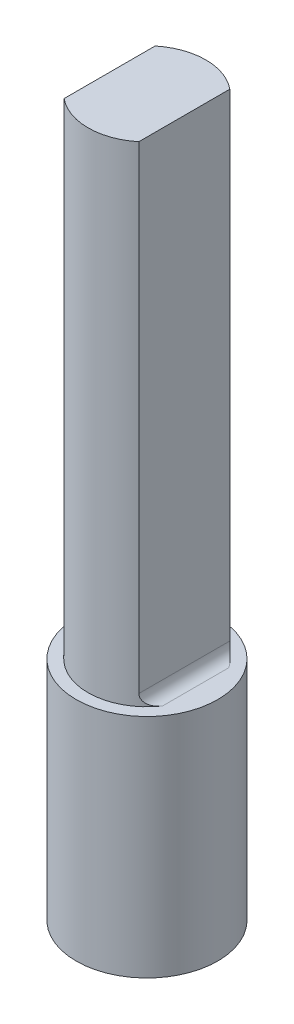
ISO-10303-21;
HEADER;
FILE_DESCRIPTION(('STEP AP214'),'2;1');
FILE_NAME('part.step','',(''),(''),'','','');
FILE_SCHEMA(('AUTOMOTIVE_DESIGN { 1 0 10303 214 1 1 1 1 }'));
ENDSEC;
DATA;
#1=APPLICATION_CONTEXT('core data for automotive mechanical design processes');
#2=APPLICATION_PROTOCOL_DEFINITION('international standard','automotive_design',2000,#1);
#3=PRODUCT_CONTEXT('',#1,'mechanical');
#4=PRODUCT('Part','Part','',(#3));
#5=PRODUCT_RELATED_PRODUCT_CATEGORY('part','',(#4));
#6=PRODUCT_DEFINITION_FORMATION('','',#4);
#7=PRODUCT_DEFINITION_CONTEXT('part definition',#1,'design');
#8=PRODUCT_DEFINITION('design','',#6,#7);
#9=PRODUCT_DEFINITION_SHAPE('','',#8);
#10=(LENGTH_UNIT() NAMED_UNIT(*) SI_UNIT(.MILLI.,.METRE.));
#11=(NAMED_UNIT(*) PLANE_ANGLE_UNIT() SI_UNIT($,.RADIAN.));
#12=(NAMED_UNIT(*) SI_UNIT($,.STERADIAN.) SOLID_ANGLE_UNIT());
#13=UNCERTAINTY_MEASURE_WITH_UNIT(LENGTH_MEASURE(1.E-05),#10,'distance_accuracy_value','');
#14=(GEOMETRIC_REPRESENTATION_CONTEXT(3) GLOBAL_UNCERTAINTY_ASSIGNED_CONTEXT((#13)) GLOBAL_UNIT_ASSIGNED_CONTEXT((#10,
#11,#12)) REPRESENTATION_CONTEXT('',''));
#15=CARTESIAN_POINT('',(0.,0.,0.));
#16=DIRECTION('',(0.,0.,1.));
#17=DIRECTION('',(1.,0.,0.));
#18=AXIS2_PLACEMENT_3D('',#15,#16,#17);
#19=CARTESIAN_POINT('',(0.,5.,0.));
#20=DIRECTION('',(0.,-1.,0.));
#21=DIRECTION('',(0.,0.,-1.));
#22=AXIS2_PLACEMENT_3D('',#19,#20,#21);
#23=CYLINDRICAL_SURFACE('',#22,3.125);
#24=CARTESIAN_POINT('',(0.,5.,0.));
#25=DIRECTION('',(0.,1.,0.));
#26=DIRECTION('',(0.,0.,1.));
#27=AXIS2_PLACEMENT_3D('',#24,#25,#26);
#28=CIRCLE('',#27,3.125);
#29=CARTESIAN_POINT('',(0.,5.,3.125));
#30=VERTEX_POINT('',#29);
#31=EDGE_CURVE('E133',#30,#30,#28,.T.);
#32=ORIENTED_EDGE('',*,*,#31,.F.);
#33=EDGE_LOOP('',(#32));
#34=FACE_BOUND('',#33,.T.);
#35=CARTESIAN_POINT('',(0.,-5.,0.));
#36=DIRECTION('',(0.,1.,0.));
#37=DIRECTION('',(0.,0.,1.));
#38=AXIS2_PLACEMENT_3D('',#35,#36,#37);
#39=CIRCLE('',#38,3.125);
#40=CARTESIAN_POINT('',(0.,-5.,3.125));
#41=VERTEX_POINT('',#40);
#42=EDGE_CURVE('E128',#41,#41,#39,.T.);
#43=ORIENTED_EDGE('',*,*,#42,.T.);
#44=EDGE_LOOP('',(#43));
#45=FACE_BOUND('',#44,.T.);
#46=ADVANCED_FACE('F39',(#34,#45),#23,.T.);
#47=CARTESIAN_POINT('',(0.,5.,0.));
#48=DIRECTION('',(0.,1.,0.));
#49=DIRECTION('',(0.,0.,1.));
#50=AXIS2_PLACEMENT_3D('',#47,#48,#49);
#51=PLANE('',#50);
#52=CARTESIAN_POINT('',(0.,5.,0.));
#53=DIRECTION('',(0.,1.,0.));
#54=DIRECTION('',(0.,0.,1.));
#55=AXIS2_PLACEMENT_3D('',#52,#53,#54);
#56=CIRCLE('',#55,2.6);
#57=CARTESIAN_POINT('',(2.15,5.,-1.46201915172134));
#58=VERTEX_POINT('',#57);
#59=CARTESIAN_POINT('',(-2.15,5.,-1.46201915172134));
#60=VERTEX_POINT('',#59);
#61=EDGE_CURVE('E122',#58,#60,#56,.T.);
#62=ORIENTED_EDGE('',*,*,#61,.F.);
#63=DIRECTION('',(0.,0.,-1.));
#64=VECTOR('',#63,1.);
#65=CARTESIAN_POINT('',(2.15,5.,0.));
#66=LINE('',#65,#64);
#67=CARTESIAN_POINT('',(2.15,5.,1.46201915172134));
#68=VERTEX_POINT('',#67);
#69=EDGE_CURVE('E149',#58,#68,#66,.F.);
#70=ORIENTED_EDGE('',*,*,#69,.T.);
#71=CARTESIAN_POINT('',(0.,5.,0.));
#72=DIRECTION('',(0.,1.,0.));
#73=DIRECTION('',(0.,0.,1.));
#74=AXIS2_PLACEMENT_3D('',#71,#72,#73);
#75=CIRCLE('',#74,2.6);
#76=CARTESIAN_POINT('',(-2.15,5.,1.46201915172134));
#77=VERTEX_POINT('',#76);
#78=EDGE_CURVE('E198',#77,#68,#75,.T.);
#79=ORIENTED_EDGE('',*,*,#78,.F.);
#80=DIRECTION('',(0.,0.,1.));
#81=VECTOR('',#80,1.);
#82=CARTESIAN_POINT('',(-2.15,5.,0.));
#83=LINE('',#82,#81);
#84=EDGE_CURVE('E145',#77,#60,#83,.F.);
#85=ORIENTED_EDGE('',*,*,#84,.T.);
#86=EDGE_LOOP('',(#62,#70,#79,#85));
#87=FACE_BOUND('',#86,.T.);
#88=ORIENTED_EDGE('',*,*,#31,.T.);
#89=EDGE_LOOP('',(#88));
#90=FACE_BOUND('',#89,.T.);
#91=ADVANCED_FACE('F181',(#87,#90),#51,.T.);
#92=CARTESIAN_POINT('',(0.,-5.,0.));
#93=DIRECTION('',(0.,1.,0.));
#94=DIRECTION('',(0.,0.,1.));
#95=AXIS2_PLACEMENT_3D('',#92,#93,#94);
#96=PLANE('',#95);
#97=ORIENTED_EDGE('',*,*,#42,.F.);
#98=EDGE_LOOP('',(#97));
#99=FACE_BOUND('',#98,.T.);
#100=ADVANCED_FACE('F183',(#99),#96,.F.);
#101=CARTESIAN_POINT('',(0.,26.6,0.));
#102=DIRECTION('',(0.,-1.,0.));
#103=DIRECTION('',(0.,0.,-1.));
#104=AXIS2_PLACEMENT_3D('',#101,#102,#103);
#105=CYLINDRICAL_SURFACE('',#104,2.6);
#106=ORIENTED_EDGE('',*,*,#78,.T.);
#107=CARTESIAN_POINT('',(2.15,5.,1.46201915172134));
#108=CARTESIAN_POINT('',(2.13214893926979,5.00000870419004,1.48828019076594));
#109=CARTESIAN_POINT('',(2.11379233462878,5.00095772820948,1.51423071888645));
#110=CARTESIAN_POINT('',(2.07615080757069,5.00511696251503,1.56544076001844));
#111=CARTESIAN_POINT('',(2.05686203017962,5.00833747457193,1.59069657807328));
#112=CARTESIAN_POINT('',(2.01731775489546,5.01749349777636,1.6405662280391));
#113=CARTESIAN_POINT('',(1.9970522414764,5.02346804601395,1.6651652588742));
#114=CARTESIAN_POINT('',(1.95617554190187,5.03858257771035,1.71299845862608));
#115=CARTESIAN_POINT('',(1.93556517218849,5.04771587882874,1.73623538866303));
#116=CARTESIAN_POINT('',(1.89400814855078,5.06984491198724,1.78148667531625));
#117=CARTESIAN_POINT('',(1.87306306365448,5.08291459991408,1.80346706348541));
#118=CARTESIAN_POINT('',(1.8320739485162,5.11325827221602,1.84508878206223));
#119=CARTESIAN_POINT('',(1.81202630739307,5.13051319214058,1.86474013387851));
#120=CARTESIAN_POINT('',(1.77671780038985,5.16654103670392,1.89836118260812));
#121=CARTESIAN_POINT('',(1.76119516866958,5.18467122856801,1.91273981687796));
#122=CARTESIAN_POINT('',(1.73224540378138,5.22417575325125,1.93899654069926));
#123=CARTESIAN_POINT('',(1.71881776056849,5.24554929393869,1.95087523913044));
#124=CARTESIAN_POINT('',(1.69679483755491,5.28768023203842,1.97004251878954));
#125=CARTESIAN_POINT('',(1.68777322159316,5.30802035739621,1.97775707271938));
#126=CARTESIAN_POINT('',(1.67237835886704,5.35038785051409,1.9907919512184));
#127=CARTESIAN_POINT('',(1.66600122472005,5.37241268489551,1.99611579109406));
#128=CARTESIAN_POINT('',(1.65748788633574,5.41204514924782,2.00318687499706));
#129=CARTESIAN_POINT('',(1.65469602119519,5.42941624755442,2.00549031907575));
#130=CARTESIAN_POINT('',(1.65094466146425,5.4645198100488,2.00857740091236));
#131=CARTESIAN_POINT('',(1.64998857491628,5.48225288469731,2.00935821201079));
#132=CARTESIAN_POINT('',(1.65,5.5,2.00935312974101));
#133=B_SPLINE_CURVE_WITH_KNOTS('',3,(#107,#108,#109,#110,#111,#112,#113,#114,#115,#116,#117,
#118,#119,#120,#121,#122,#123,#124,#125,#126,#127,#128,#129,#130,#131,#132),.UNSPECIFIED.,.F.,
.F.,(4,2,2,2,2,2,2,2,2,2,2,2,4),(0.,0.0952835776654719,0.191002092392971,0.288121186733857,
0.385036069844265,0.483899246283,0.58232027321788,0.665588173496877,0.74883576966989,
0.819190036406663,0.889440512736171,0.942515985758388,0.995689896160678),.UNSPECIFIED.);
#134=CARTESIAN_POINT('',(1.65,5.50000000000001,2.00935312974101));
#135=VERTEX_POINT('',#134);
#136=EDGE_CURVE('E126',#68,#135,#133,.T.);
#137=ORIENTED_EDGE('',*,*,#136,.T.);
#138=DIRECTION('',(0.,-1.,0.));
#139=VECTOR('',#138,1.);
#140=CARTESIAN_POINT('',(1.65,26.6,2.00935312974101));
#141=LINE('',#140,#139);
#142=CARTESIAN_POINT('',(1.65,26.6,2.00935312974101));
#143=VERTEX_POINT('',#142);
#144=EDGE_CURVE('E104',#143,#135,#141,.T.);
#145=ORIENTED_EDGE('',*,*,#144,.F.);
#146=CARTESIAN_POINT('',(0.,26.6,0.));
#147=DIRECTION('',(0.,1.,0.));
#148=DIRECTION('',(0.,0.,1.));
#149=AXIS2_PLACEMENT_3D('',#146,#147,#148);
#150=CIRCLE('',#149,2.6);
#151=CARTESIAN_POINT('',(-1.65,26.6,2.00935312974101));
#152=VERTEX_POINT('',#151);
#153=EDGE_CURVE('E112',#152,#143,#150,.T.);
#154=ORIENTED_EDGE('',*,*,#153,.F.);
#155=DIRECTION('',(0.,-1.,0.));
#156=VECTOR('',#155,1.);
#157=CARTESIAN_POINT('',(-1.65,26.6,2.00935312974101));
#158=LINE('',#157,#156);
#159=CARTESIAN_POINT('',(-1.65,5.50000000000001,2.00935312974101));
#160=VERTEX_POINT('',#159);
#161=EDGE_CURVE('E199',#152,#160,#158,.T.);
#162=ORIENTED_EDGE('',*,*,#161,.T.);
#163=CARTESIAN_POINT('',(-1.65,5.5,2.00935312974101));
#164=CARTESIAN_POINT('',(-1.64996359471725,5.47681076749336,2.00937109235813));
#165=CARTESIAN_POINT('',(-1.65161080389504,5.45365308239492,2.00803048983314));
#166=CARTESIAN_POINT('',(-1.6579790276271,5.40818822793188,2.00278177353478));
#167=CARTESIAN_POINT('',(-1.66268321653932,5.3858771063642,1.99888771295884));
#168=CARTESIAN_POINT('',(-1.67487061306382,5.34265031230238,1.98868478727566));
#169=CARTESIAN_POINT('',(-1.68235059713593,5.32173305421646,1.9823787229766));
#170=CARTESIAN_POINT('',(-1.69964205747362,5.28170356649006,1.96757389514596));
#171=CARTESIAN_POINT('',(-1.70945623319133,5.2625934628228,1.95907259187564));
#172=CARTESIAN_POINT('',(-1.73150111467578,5.22550119731475,1.93962116379359));
#173=CARTESIAN_POINT('',(-1.74383455457759,5.20763770909652,1.9285626214157));
#174=CARTESIAN_POINT('',(-1.76995105661626,5.17440846214165,1.90462282646724));
#175=CARTESIAN_POINT('',(-1.78373364992343,5.15904189967053,1.8917421629258));
#176=CARTESIAN_POINT('',(-1.81979638970047,5.12329378355633,1.85721444602951));
#177=CARTESIAN_POINT('',(-1.84271748159403,5.10455454989635,1.83453237371767));
#178=CARTESIAN_POINT('',(-1.88948319843094,5.07227839807329,1.78633467373363));
#179=CARTESIAN_POINT('',(-1.91333275460446,5.05877519311738,1.760802003668));
#180=CARTESIAN_POINT('',(-1.95584582695472,5.03877036355263,1.71331834986592));
#181=CARTESIAN_POINT('',(-1.97453999191053,5.03139210363866,1.69175102240118));
#182=CARTESIAN_POINT('',(-2.01155764044862,5.01915262909687,1.64756412692859));
#183=CARTESIAN_POINT('',(-2.02988058714538,5.01429484035404,1.62494317205063));
#184=CARTESIAN_POINT('',(-2.06561235508679,5.00684003118643,1.57926309675821));
#185=CARTESIAN_POINT('',(-2.0830313347159,5.00420659281877,1.55621761265066));
#186=CARTESIAN_POINT('',(-2.11710338397585,5.00079243236116,1.50953976907778));
#187=CARTESIAN_POINT('',(-2.13375865793499,5.00000599940425,1.48590944751401));
#188=CARTESIAN_POINT('',(-2.15,5.,1.46201915172134));
#189=B_SPLINE_CURVE_WITH_KNOTS('',3,(#163,#164,#165,#166,#167,#168,#169,#170,#171,#172,#173,
#174,#175,#176,#177,#178,#179,#180,#181,#182,#183,#184,#185,#186,#187,#188),.UNSPECIFIED.,.F.,
.F.,(4,2,2,2,2,2,2,2,2,2,2,2,4),(0.,0.069420921790127,0.138462949974686,0.207425049061173,
0.27646729277555,0.349281770719914,0.422072763809251,0.533338164048136,0.645308522464324,
0.73361190587309,0.822035000995784,0.908980676152648,0.995657162792072),.UNSPECIFIED.);
#190=EDGE_CURVE('E54',#160,#77,#189,.T.);
#191=ORIENTED_EDGE('',*,*,#190,.T.);
#192=EDGE_LOOP('',(#106,#137,#145,#154,#162,#191));
#193=FACE_BOUND('',#192,.T.);
#194=ADVANCED_FACE('F124',(#193),#105,.T.);
#195=CARTESIAN_POINT('',(1.65,26.6,-2.00935312974101));
#196=DIRECTION('',(-1.,0.,0.));
#197=DIRECTION('',(0.,0.,1.));
#198=AXIS2_PLACEMENT_3D('',#195,#196,#197);
#199=PLANE('',#198);
#200=ORIENTED_EDGE('',*,*,#144,.T.);
#201=DIRECTION('',(0.,0.,-1.));
#202=VECTOR('',#201,1.);
#203=CARTESIAN_POINT('',(1.65,5.5,-2.00935312974101));
#204=LINE('',#203,#202);
#205=CARTESIAN_POINT('',(1.65,5.50000000000001,-2.00935312974101));
#206=VERTEX_POINT('',#205);
#207=EDGE_CURVE('E141',#135,#206,#204,.T.);
#208=ORIENTED_EDGE('',*,*,#207,.T.);
#209=DIRECTION('',(0.,-1.,0.));
#210=VECTOR('',#209,1.);
#211=CARTESIAN_POINT('',(1.65,26.6,-2.00935312974101));
#212=LINE('',#211,#210);
#213=CARTESIAN_POINT('',(1.65,26.6,-2.00935312974101));
#214=VERTEX_POINT('',#213);
#215=EDGE_CURVE('E107',#214,#206,#212,.T.);
#216=ORIENTED_EDGE('',*,*,#215,.F.);
#217=DIRECTION('',(0.,0.,-1.));
#218=VECTOR('',#217,1.);
#219=CARTESIAN_POINT('',(1.65,26.6,-2.00935312974101));
#220=LINE('',#219,#218);
#221=EDGE_CURVE('E99',#143,#214,#220,.T.);
#222=ORIENTED_EDGE('',*,*,#221,.F.);
#223=EDGE_LOOP('',(#200,#208,#216,#222));
#224=FACE_BOUND('',#223,.T.);
#225=ADVANCED_FACE('F101',(#224),#199,.F.);
#226=CARTESIAN_POINT('',(0.,26.6,0.));
#227=DIRECTION('',(0.,-1.,0.));
#228=DIRECTION('',(0.,0.,-1.));
#229=AXIS2_PLACEMENT_3D('',#226,#227,#228);
#230=CYLINDRICAL_SURFACE('',#229,2.6);
#231=ORIENTED_EDGE('',*,*,#61,.T.);
#232=CARTESIAN_POINT('',(-2.15,5.,-1.46201915172134));
#233=CARTESIAN_POINT('',(-2.13214893926979,5.00000870419004,-1.48828019076594));
#234=CARTESIAN_POINT('',(-2.11379233462878,5.00095772820948,-1.51423071888645));
#235=CARTESIAN_POINT('',(-2.07615080757069,5.00511696251503,-1.56544076001844));
#236=CARTESIAN_POINT('',(-2.05686203017962,5.00833747457193,-1.59069657807328));
#237=CARTESIAN_POINT('',(-2.01731775489546,5.01749349777636,-1.6405662280391));
#238=CARTESIAN_POINT('',(-1.9970522414764,5.02346804601395,-1.6651652588742));
#239=CARTESIAN_POINT('',(-1.95617554190187,5.03858257771035,-1.71299845862608));
#240=CARTESIAN_POINT('',(-1.93556517218849,5.04771587882874,-1.73623538866303));
#241=CARTESIAN_POINT('',(-1.89400814855078,5.06984491198724,-1.78148667531625));
#242=CARTESIAN_POINT('',(-1.87306306365448,5.08291459991408,-1.80346706348541));
#243=CARTESIAN_POINT('',(-1.8320739485162,5.11325827221602,-1.84508878206223));
#244=CARTESIAN_POINT('',(-1.81202630739307,5.13051319214058,-1.86474013387851));
#245=CARTESIAN_POINT('',(-1.77671780038985,5.16654103670392,-1.89836118260812));
#246=CARTESIAN_POINT('',(-1.76119516866958,5.18467122856801,-1.91273981687796));
#247=CARTESIAN_POINT('',(-1.73224540378138,5.22417575325125,-1.93899654069926));
#248=CARTESIAN_POINT('',(-1.71881776056849,5.24554929393869,-1.95087523913044));
#249=CARTESIAN_POINT('',(-1.69679483755491,5.28768023203842,-1.97004251878954));
#250=CARTESIAN_POINT('',(-1.68777322159316,5.30802035739621,-1.97775707271938));
#251=CARTESIAN_POINT('',(-1.67237835886704,5.35038785051409,-1.9907919512184));
#252=CARTESIAN_POINT('',(-1.66600122472005,5.37241268489551,-1.99611579109406));
#253=CARTESIAN_POINT('',(-1.65748788633574,5.41204514924782,-2.00318687499706));
#254=CARTESIAN_POINT('',(-1.65469602119519,5.42941624755442,-2.00549031907575));
#255=CARTESIAN_POINT('',(-1.65094466146425,5.4645198100488,-2.00857740091236));
#256=CARTESIAN_POINT('',(-1.64998857491628,5.48225288469731,-2.00935821201079));
#257=CARTESIAN_POINT('',(-1.65,5.5,-2.00935312974101));
#258=B_SPLINE_CURVE_WITH_KNOTS('',3,(#232,#233,#234,#235,#236,#237,#238,#239,#240,#241,#242,
#243,#244,#245,#246,#247,#248,#249,#250,#251,#252,#253,#254,#255,#256,#257),.UNSPECIFIED.,.F.,
.F.,(4,2,2,2,2,2,2,2,2,2,2,2,4),(0.,0.0952835776654723,0.191002092392972,0.288121186733858,
0.385036069844266,0.483899246283002,0.582320273217881,0.665588173496879,0.74883576966989,
0.819190036406663,0.889440512736172,0.94251598575839,0.995689896160678),.UNSPECIFIED.);
#259=CARTESIAN_POINT('',(-1.65,5.50000000000001,-2.00935312974101));
#260=VERTEX_POINT('',#259);
#261=EDGE_CURVE('E11',#60,#260,#258,.T.);
#262=ORIENTED_EDGE('',*,*,#261,.T.);
#263=DIRECTION('',(0.,-1.,0.));
#264=VECTOR('',#263,1.);
#265=CARTESIAN_POINT('',(-1.65,26.6,-2.00935312974101));
#266=LINE('',#265,#264);
#267=CARTESIAN_POINT('',(-1.65,26.6,-2.00935312974101));
#268=VERTEX_POINT('',#267);
#269=EDGE_CURVE('E135',#268,#260,#266,.T.);
#270=ORIENTED_EDGE('',*,*,#269,.F.);
#271=CARTESIAN_POINT('',(0.,26.6,0.));
#272=DIRECTION('',(0.,1.,0.));
#273=DIRECTION('',(0.,0.,1.));
#274=AXIS2_PLACEMENT_3D('',#271,#272,#273);
#275=CIRCLE('',#274,2.6);
#276=EDGE_CURVE('E111',#214,#268,#275,.T.);
#277=ORIENTED_EDGE('',*,*,#276,.F.);
#278=ORIENTED_EDGE('',*,*,#215,.T.);
#279=CARTESIAN_POINT('',(1.65,5.5,-2.00935312974101));
#280=CARTESIAN_POINT('',(1.64996359471725,5.47681076749336,-2.00937109235813));
#281=CARTESIAN_POINT('',(1.65161080389504,5.45365308239492,-2.00803048983314));
#282=CARTESIAN_POINT('',(1.6579790276271,5.40818822793188,-2.00278177353478));
#283=CARTESIAN_POINT('',(1.66268321653932,5.3858771063642,-1.99888771295884));
#284=CARTESIAN_POINT('',(1.67487061306382,5.34265031230238,-1.98868478727566));
#285=CARTESIAN_POINT('',(1.68235059713593,5.32173305421646,-1.9823787229766));
#286=CARTESIAN_POINT('',(1.69964205747362,5.28170356649006,-1.96757389514596));
#287=CARTESIAN_POINT('',(1.70945623319133,5.2625934628228,-1.95907259187564));
#288=CARTESIAN_POINT('',(1.73150111467578,5.22550119731475,-1.93962116379359));
#289=CARTESIAN_POINT('',(1.74383455457759,5.20763770909652,-1.9285626214157));
#290=CARTESIAN_POINT('',(1.76995105661626,5.17440846214165,-1.90462282646724));
#291=CARTESIAN_POINT('',(1.78373364992343,5.15904189967053,-1.8917421629258));
#292=CARTESIAN_POINT('',(1.81979638970047,5.12329378355633,-1.85721444602951));
#293=CARTESIAN_POINT('',(1.84271748159403,5.10455454989635,-1.83453237371767));
#294=CARTESIAN_POINT('',(1.88948319843094,5.07227839807329,-1.78633467373363));
#295=CARTESIAN_POINT('',(1.91333275460446,5.05877519311738,-1.760802003668));
#296=CARTESIAN_POINT('',(1.95584582695472,5.03877036355263,-1.71331834986592));
#297=CARTESIAN_POINT('',(1.97453999191053,5.03139210363866,-1.69175102240118));
#298=CARTESIAN_POINT('',(2.01155764044862,5.01915262909687,-1.64756412692859));
#299=CARTESIAN_POINT('',(2.02988058714538,5.01429484035404,-1.62494317205063));
#300=CARTESIAN_POINT('',(2.06561235508679,5.00684003118643,-1.57926309675821));
#301=CARTESIAN_POINT('',(2.0830313347159,5.00420659281877,-1.55621761265066));
#302=CARTESIAN_POINT('',(2.11710338397585,5.00079243236116,-1.50953976907778));
#303=CARTESIAN_POINT('',(2.13375865793499,5.00000599940425,-1.48590944751401));
#304=CARTESIAN_POINT('',(2.15,5.,-1.46201915172134));
#305=B_SPLINE_CURVE_WITH_KNOTS('',3,(#279,#280,#281,#282,#283,#284,#285,#286,#287,#288,#289,
#290,#291,#292,#293,#294,#295,#296,#297,#298,#299,#300,#301,#302,#303,#304),.UNSPECIFIED.,.F.,
.F.,(4,2,2,2,2,2,2,2,2,2,2,2,4),(0.,0.0694209217901271,0.138462949974686,0.207425049061173,
0.27646729277555,0.349281770719914,0.422072763809251,0.533338164048136,0.645308522464325,
0.733611905873091,0.822035000995784,0.908980676152648,0.995657162792071),.UNSPECIFIED.);
#306=EDGE_CURVE('E156',#206,#58,#305,.T.);
#307=ORIENTED_EDGE('',*,*,#306,.T.);
#308=EDGE_LOOP('',(#231,#262,#270,#277,#278,#307));
#309=FACE_BOUND('',#308,.T.);
#310=ADVANCED_FACE('F169',(#309),#230,.T.);
#311=CARTESIAN_POINT('',(-1.65,26.6,2.00935312974101));
#312=DIRECTION('',(1.,0.,0.));
#313=DIRECTION('',(0.,0.,-1.));
#314=AXIS2_PLACEMENT_3D('',#311,#312,#313);
#315=PLANE('',#314);
#316=ORIENTED_EDGE('',*,*,#269,.T.);
#317=DIRECTION('',(0.,0.,1.));
#318=VECTOR('',#317,1.);
#319=CARTESIAN_POINT('',(-1.65,5.5,2.00935312974101));
#320=LINE('',#319,#318);
#321=EDGE_CURVE('E153',#260,#160,#320,.T.);
#322=ORIENTED_EDGE('',*,*,#321,.T.);
#323=ORIENTED_EDGE('',*,*,#161,.F.);
#324=DIRECTION('',(0.,0.,1.));
#325=VECTOR('',#324,1.);
#326=CARTESIAN_POINT('',(-1.65,26.6,2.00935312974101));
#327=LINE('',#326,#325);
#328=EDGE_CURVE('E117',#268,#152,#327,.T.);
#329=ORIENTED_EDGE('',*,*,#328,.F.);
#330=EDGE_LOOP('',(#316,#322,#323,#329));
#331=FACE_BOUND('',#330,.T.);
#332=ADVANCED_FACE('F212',(#331),#315,.F.);
#333=CARTESIAN_POINT('',(0.,26.6,0.));
#334=DIRECTION('',(0.,1.,0.));
#335=DIRECTION('',(0.,0.,1.));
#336=AXIS2_PLACEMENT_3D('',#333,#334,#335);
#337=PLANE('',#336);
#338=ORIENTED_EDGE('',*,*,#153,.T.);
#339=ORIENTED_EDGE('',*,*,#221,.T.);
#340=ORIENTED_EDGE('',*,*,#276,.T.);
#341=ORIENTED_EDGE('',*,*,#328,.T.);
#342=EDGE_LOOP('',(#338,#339,#340,#341));
#343=FACE_BOUND('',#342,.T.);
#344=ADVANCED_FACE('F115',(#343),#337,.T.);
#345=CARTESIAN_POINT('',(2.15,5.5,-2.00935312974101));
#346=DIRECTION('',(0.,0.,-1.));
#347=DIRECTION('',(-1.,0.,0.));
#348=AXIS2_PLACEMENT_3D('',#345,#346,#347);
#349=CYLINDRICAL_SURFACE('',#348,0.5);
#350=ORIENTED_EDGE('',*,*,#136,.F.);
#351=ORIENTED_EDGE('',*,*,#69,.F.);
#352=ORIENTED_EDGE('',*,*,#306,.F.);
#353=ORIENTED_EDGE('',*,*,#207,.F.);
#354=EDGE_LOOP('',(#350,#351,#352,#353));
#355=FACE_BOUND('',#354,.T.);
#356=ADVANCED_FACE('F173',(#355),#349,.F.);
#357=CARTESIAN_POINT('',(-2.15,5.5,2.00935312974101));
#358=DIRECTION('',(0.,0.,1.));
#359=DIRECTION('',(1.,0.,0.));
#360=AXIS2_PLACEMENT_3D('',#357,#358,#359);
#361=CYLINDRICAL_SURFACE('',#360,0.5);
#362=ORIENTED_EDGE('',*,*,#261,.F.);
#363=ORIENTED_EDGE('',*,*,#84,.F.);
#364=ORIENTED_EDGE('',*,*,#190,.F.);
#365=ORIENTED_EDGE('',*,*,#321,.F.);
#366=EDGE_LOOP('',(#362,#363,#364,#365));
#367=FACE_BOUND('',#366,.T.);
#368=ADVANCED_FACE('F41',(#367),#361,.F.);
#369=CLOSED_SHELL('',(#46,#91,#100,#194,#225,#310,#332,#344,#356,#368));
#370=MANIFOLD_SOLID_BREP('B2',#369);
#371=ADVANCED_BREP_SHAPE_REPRESENTATION('',(#18,#370),#14);
#372=SHAPE_DEFINITION_REPRESENTATION(#9,#371);
ENDSEC;
END-ISO-10303-21;
